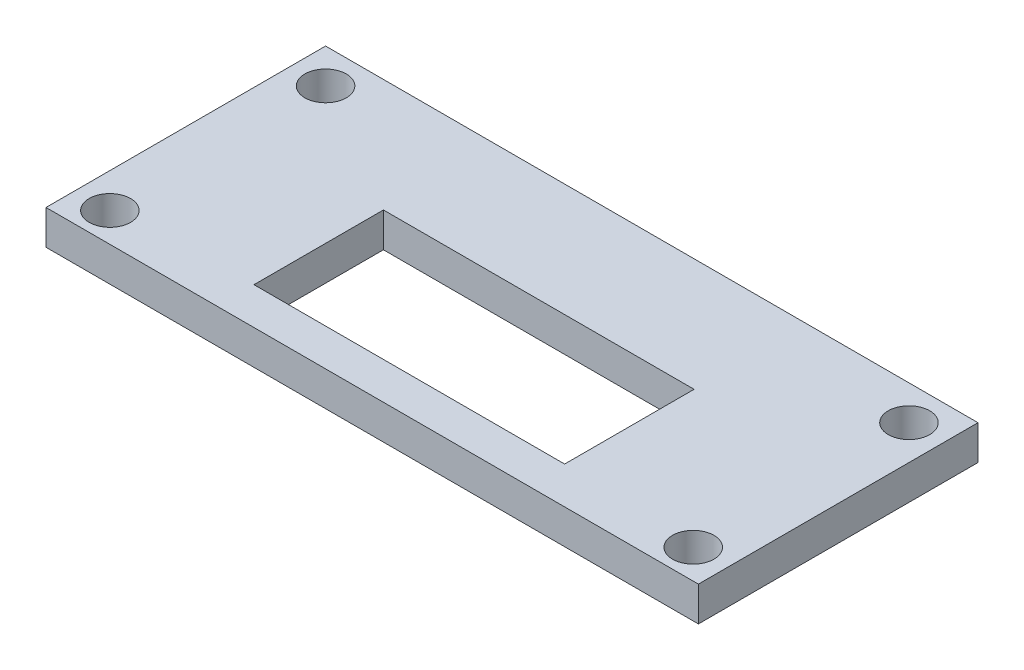
ISO-10303-21;
HEADER;
FILE_DESCRIPTION(('STEP AP214'),'2;1');
FILE_NAME('part.step','',(''),(''),'','','');
FILE_SCHEMA(('AUTOMOTIVE_DESIGN { 1 0 10303 214 1 1 1 1 }'));
ENDSEC;
DATA;
#1=APPLICATION_CONTEXT('core data for automotive mechanical design processes');
#2=APPLICATION_PROTOCOL_DEFINITION('international standard','automotive_design',2000,#1);
#3=PRODUCT_CONTEXT('',#1,'mechanical');
#4=PRODUCT('Part','Part','',(#3));
#5=PRODUCT_RELATED_PRODUCT_CATEGORY('part','',(#4));
#6=PRODUCT_DEFINITION_FORMATION('','',#4);
#7=PRODUCT_DEFINITION_CONTEXT('part definition',#1,'design');
#8=PRODUCT_DEFINITION('design','',#6,#7);
#9=PRODUCT_DEFINITION_SHAPE('','',#8);
#10=(LENGTH_UNIT() NAMED_UNIT(*) SI_UNIT(.MILLI.,.METRE.));
#11=(NAMED_UNIT(*) PLANE_ANGLE_UNIT() SI_UNIT($,.RADIAN.));
#12=(NAMED_UNIT(*) SI_UNIT($,.STERADIAN.) SOLID_ANGLE_UNIT());
#13=UNCERTAINTY_MEASURE_WITH_UNIT(LENGTH_MEASURE(1.E-05),#10,'distance_accuracy_value','');
#14=(GEOMETRIC_REPRESENTATION_CONTEXT(3) GLOBAL_UNCERTAINTY_ASSIGNED_CONTEXT((#13)) GLOBAL_UNIT_ASSIGNED_CONTEXT((#10,
#11,#12)) REPRESENTATION_CONTEXT('',''));
#15=CARTESIAN_POINT('',(0.,0.,0.));
#16=DIRECTION('',(0.,0.,1.));
#17=DIRECTION('',(1.,0.,0.));
#18=AXIS2_PLACEMENT_3D('',#15,#16,#17);
#19=CARTESIAN_POINT('',(0.,17.,0.));
#20=DIRECTION('',(0.,1.,0.));
#21=DIRECTION('',(0.,0.,1.));
#22=AXIS2_PLACEMENT_3D('',#19,#20,#21);
#23=PLANE('',#22);
#24=CARTESIAN_POINT('',(-16.9,17.,-43.5));
#25=DIRECTION('',(0.,1.,0.));
#26=DIRECTION('',(0.,0.,1.));
#27=AXIS2_PLACEMENT_3D('',#24,#25,#26);
#28=CIRCLE('',#27,1.2);
#29=CARTESIAN_POINT('',(-16.9,17.,-42.3));
#30=VERTEX_POINT('',#29);
#31=EDGE_CURVE('E117',#30,#30,#28,.F.);
#32=ORIENTED_EDGE('',*,*,#31,.T.);
#33=EDGE_LOOP('',(#32));
#34=FACE_BOUND('',#33,.T.);
#35=CARTESIAN_POINT('',(16.9,17.,-31.));
#36=DIRECTION('',(0.,1.,0.));
#37=DIRECTION('',(0.,0.,1.));
#38=AXIS2_PLACEMENT_3D('',#35,#36,#37);
#39=CIRCLE('',#38,1.2);
#40=CARTESIAN_POINT('',(16.9,17.,-29.8));
#41=VERTEX_POINT('',#40);
#42=EDGE_CURVE('E169',#41,#41,#39,.F.);
#43=ORIENTED_EDGE('',*,*,#42,.T.);
#44=EDGE_LOOP('',(#43));
#45=FACE_BOUND('',#44,.T.);
#46=CARTESIAN_POINT('',(16.9,17.,-43.5));
#47=DIRECTION('',(0.,1.,0.));
#48=DIRECTION('',(0.,0.,1.));
#49=AXIS2_PLACEMENT_3D('',#46,#47,#48);
#50=CIRCLE('',#49,1.2);
#51=CARTESIAN_POINT('',(16.9,17.,-42.3));
#52=VERTEX_POINT('',#51);
#53=EDGE_CURVE('E166',#52,#52,#50,.F.);
#54=ORIENTED_EDGE('',*,*,#53,.T.);
#55=EDGE_LOOP('',(#54));
#56=FACE_BOUND('',#55,.T.);
#57=CARTESIAN_POINT('',(-16.9,17.,-31.));
#58=DIRECTION('',(0.,1.,0.));
#59=DIRECTION('',(0.,0.,1.));
#60=AXIS2_PLACEMENT_3D('',#57,#58,#59);
#61=CIRCLE('',#60,1.2);
#62=CARTESIAN_POINT('',(-16.9,17.,-29.8));
#63=VERTEX_POINT('',#62);
#64=EDGE_CURVE('E163',#63,#63,#61,.F.);
#65=ORIENTED_EDGE('',*,*,#64,.T.);
#66=EDGE_LOOP('',(#65));
#67=FACE_BOUND('',#66,.T.);
#68=DIRECTION('',(0.,0.,1.));
#69=VECTOR('',#68,1.);
#70=CARTESIAN_POINT('',(-18.9,17.,-45.5));
#71=LINE('',#70,#69);
#72=CARTESIAN_POINT('',(-18.9,17.,-45.5));
#73=VERTEX_POINT('',#72);
#74=CARTESIAN_POINT('',(-18.9,17.,-29.3));
#75=VERTEX_POINT('',#74);
#76=EDGE_CURVE('E129',#73,#75,#71,.T.);
#77=ORIENTED_EDGE('',*,*,#76,.T.);
#78=DIRECTION('',(1.,0.,0.));
#79=VECTOR('',#78,1.);
#80=CARTESIAN_POINT('',(-18.9,17.,-29.3));
#81=LINE('',#80,#79);
#82=CARTESIAN_POINT('',(18.9,17.,-29.3));
#83=VERTEX_POINT('',#82);
#84=EDGE_CURVE('E132',#75,#83,#81,.T.);
#85=ORIENTED_EDGE('',*,*,#84,.T.);
#86=DIRECTION('',(0.,0.,-1.));
#87=VECTOR('',#86,1.);
#88=CARTESIAN_POINT('',(18.9,17.,-29.3));
#89=LINE('',#88,#87);
#90=CARTESIAN_POINT('',(18.9,17.,-45.5));
#91=VERTEX_POINT('',#90);
#92=EDGE_CURVE('E135',#83,#91,#89,.T.);
#93=ORIENTED_EDGE('',*,*,#92,.T.);
#94=DIRECTION('',(-1.,0.,0.));
#95=VECTOR('',#94,1.);
#96=CARTESIAN_POINT('',(18.9,17.,-45.5));
#97=LINE('',#96,#95);
#98=EDGE_CURVE('E137',#91,#73,#97,.T.);
#99=ORIENTED_EDGE('',*,*,#98,.T.);
#100=EDGE_LOOP('',(#77,#85,#93,#99));
#101=FACE_BOUND('',#100,.T.);
#102=DIRECTION('',(-1.,0.,0.));
#103=VECTOR('',#102,1.);
#104=CARTESIAN_POINT('',(0.,17.,-31.45));
#105=LINE('',#104,#103);
#106=CARTESIAN_POINT('',(9.,17.,-31.45));
#107=VERTEX_POINT('',#106);
#108=CARTESIAN_POINT('',(-9.,17.,-31.45));
#109=VERTEX_POINT('',#108);
#110=EDGE_CURVE('E120',#107,#109,#105,.T.);
#111=ORIENTED_EDGE('',*,*,#110,.T.);
#112=DIRECTION('',(0.,0.,-1.));
#113=VECTOR('',#112,1.);
#114=CARTESIAN_POINT('',(-9.,17.,0.));
#115=LINE('',#114,#113);
#116=CARTESIAN_POINT('',(-9.,17.,-38.95));
#117=VERTEX_POINT('',#116);
#118=EDGE_CURVE('E113',#109,#117,#115,.T.);
#119=ORIENTED_EDGE('',*,*,#118,.T.);
#120=DIRECTION('',(1.,0.,0.));
#121=VECTOR('',#120,1.);
#122=CARTESIAN_POINT('',(0.,17.,-38.95));
#123=LINE('',#122,#121);
#124=CARTESIAN_POINT('',(9.,17.,-38.95));
#125=VERTEX_POINT('',#124);
#126=EDGE_CURVE('E102',#117,#125,#123,.T.);
#127=ORIENTED_EDGE('',*,*,#126,.T.);
#128=DIRECTION('',(0.,0.,1.));
#129=VECTOR('',#128,1.);
#130=CARTESIAN_POINT('',(9.,17.,0.));
#131=LINE('',#130,#129);
#132=EDGE_CURVE('E107',#125,#107,#131,.T.);
#133=ORIENTED_EDGE('',*,*,#132,.T.);
#134=EDGE_LOOP('',(#111,#119,#127,#133));
#135=FACE_BOUND('',#134,.T.);
#136=ADVANCED_FACE('F39',(#34,#45,#56,#67,#101,#135),#23,.T.);
#137=CARTESIAN_POINT('',(0.,15.,0.));
#138=DIRECTION('',(0.,1.,0.));
#139=DIRECTION('',(0.,0.,1.));
#140=AXIS2_PLACEMENT_3D('',#137,#138,#139);
#141=PLANE('',#140);
#142=CARTESIAN_POINT('',(-16.9,15.,-43.5));
#143=DIRECTION('',(0.,1.,0.));
#144=DIRECTION('',(0.,0.,1.));
#145=AXIS2_PLACEMENT_3D('',#142,#143,#144);
#146=CIRCLE('',#145,1.2);
#147=CARTESIAN_POINT('',(-16.9,15.,-42.3));
#148=VERTEX_POINT('',#147);
#149=EDGE_CURVE('E43',#148,#148,#146,.F.);
#150=ORIENTED_EDGE('',*,*,#149,.F.);
#151=EDGE_LOOP('',(#150));
#152=FACE_BOUND('',#151,.T.);
#153=CARTESIAN_POINT('',(16.9,15.,-31.));
#154=DIRECTION('',(0.,1.,0.));
#155=DIRECTION('',(0.,0.,1.));
#156=AXIS2_PLACEMENT_3D('',#153,#154,#155);
#157=CIRCLE('',#156,1.2);
#158=CARTESIAN_POINT('',(16.9,15.,-29.8));
#159=VERTEX_POINT('',#158);
#160=EDGE_CURVE('E167',#159,#159,#157,.F.);
#161=ORIENTED_EDGE('',*,*,#160,.F.);
#162=EDGE_LOOP('',(#161));
#163=FACE_BOUND('',#162,.T.);
#164=CARTESIAN_POINT('',(16.9,15.,-43.5));
#165=DIRECTION('',(0.,1.,0.));
#166=DIRECTION('',(0.,0.,1.));
#167=AXIS2_PLACEMENT_3D('',#164,#165,#166);
#168=CIRCLE('',#167,1.2);
#169=CARTESIAN_POINT('',(16.9,15.,-42.3));
#170=VERTEX_POINT('',#169);
#171=EDGE_CURVE('E164',#170,#170,#168,.F.);
#172=ORIENTED_EDGE('',*,*,#171,.F.);
#173=EDGE_LOOP('',(#172));
#174=FACE_BOUND('',#173,.T.);
#175=CARTESIAN_POINT('',(-16.9,15.,-31.));
#176=DIRECTION('',(0.,1.,0.));
#177=DIRECTION('',(0.,0.,1.));
#178=AXIS2_PLACEMENT_3D('',#175,#176,#177);
#179=CIRCLE('',#178,1.2);
#180=CARTESIAN_POINT('',(-16.9,15.,-29.8));
#181=VERTEX_POINT('',#180);
#182=EDGE_CURVE('E160',#181,#181,#179,.F.);
#183=ORIENTED_EDGE('',*,*,#182,.F.);
#184=EDGE_LOOP('',(#183));
#185=FACE_BOUND('',#184,.T.);
#186=DIRECTION('',(0.,0.,1.));
#187=VECTOR('',#186,1.);
#188=CARTESIAN_POINT('',(-18.9,15.,-45.5));
#189=LINE('',#188,#187);
#190=CARTESIAN_POINT('',(-18.9,15.,-45.5));
#191=VERTEX_POINT('',#190);
#192=CARTESIAN_POINT('',(-18.9,15.,-29.3));
#193=VERTEX_POINT('',#192);
#194=EDGE_CURVE('E121',#191,#193,#189,.T.);
#195=ORIENTED_EDGE('',*,*,#194,.F.);
#196=DIRECTION('',(-1.,0.,0.));
#197=VECTOR('',#196,1.);
#198=CARTESIAN_POINT('',(18.9,15.,-45.5));
#199=LINE('',#198,#197);
#200=CARTESIAN_POINT('',(18.9,15.,-45.5));
#201=VERTEX_POINT('',#200);
#202=EDGE_CURVE('E133',#201,#191,#199,.T.);
#203=ORIENTED_EDGE('',*,*,#202,.F.);
#204=DIRECTION('',(0.,0.,-1.));
#205=VECTOR('',#204,1.);
#206=CARTESIAN_POINT('',(18.9,15.,-29.3));
#207=LINE('',#206,#205);
#208=CARTESIAN_POINT('',(18.9,15.,-29.3));
#209=VERTEX_POINT('',#208);
#210=EDGE_CURVE('E141',#209,#201,#207,.T.);
#211=ORIENTED_EDGE('',*,*,#210,.F.);
#212=DIRECTION('',(1.,0.,0.));
#213=VECTOR('',#212,1.);
#214=CARTESIAN_POINT('',(-18.9,15.,-29.3));
#215=LINE('',#214,#213);
#216=EDGE_CURVE('E124',#193,#209,#215,.T.);
#217=ORIENTED_EDGE('',*,*,#216,.F.);
#218=EDGE_LOOP('',(#195,#203,#211,#217));
#219=FACE_BOUND('',#218,.T.);
#220=DIRECTION('',(0.,0.,-1.));
#221=VECTOR('',#220,1.);
#222=CARTESIAN_POINT('',(-9.,15.,0.));
#223=LINE('',#222,#221);
#224=CARTESIAN_POINT('',(-9.,15.,-31.45));
#225=VERTEX_POINT('',#224);
#226=CARTESIAN_POINT('',(-9.,15.,-38.95));
#227=VERTEX_POINT('',#226);
#228=EDGE_CURVE('E11',#225,#227,#223,.T.);
#229=ORIENTED_EDGE('',*,*,#228,.F.);
#230=DIRECTION('',(-1.,0.,0.));
#231=VECTOR('',#230,1.);
#232=CARTESIAN_POINT('',(0.,15.,-31.45));
#233=LINE('',#232,#231);
#234=CARTESIAN_POINT('',(9.,15.,-31.45));
#235=VERTEX_POINT('',#234);
#236=EDGE_CURVE('E48',#235,#225,#233,.T.);
#237=ORIENTED_EDGE('',*,*,#236,.F.);
#238=DIRECTION('',(0.,0.,1.));
#239=VECTOR('',#238,1.);
#240=CARTESIAN_POINT('',(9.,15.,0.));
#241=LINE('',#240,#239);
#242=CARTESIAN_POINT('',(9.,15.,-38.95));
#243=VERTEX_POINT('',#242);
#244=EDGE_CURVE('E157',#243,#235,#241,.T.);
#245=ORIENTED_EDGE('',*,*,#244,.F.);
#246=DIRECTION('',(1.,0.,0.));
#247=VECTOR('',#246,1.);
#248=CARTESIAN_POINT('',(0.,15.,-38.95));
#249=LINE('',#248,#247);
#250=EDGE_CURVE('E155',#227,#243,#249,.T.);
#251=ORIENTED_EDGE('',*,*,#250,.F.);
#252=EDGE_LOOP('',(#229,#237,#245,#251));
#253=FACE_BOUND('',#252,.T.);
#254=ADVANCED_FACE('F194',(#152,#163,#174,#185,#219,#253),#141,.F.);
#255=CARTESIAN_POINT('',(-18.9,17.,-45.5));
#256=DIRECTION('',(1.,0.,0.));
#257=DIRECTION('',(0.,0.,-1.));
#258=AXIS2_PLACEMENT_3D('',#255,#256,#257);
#259=PLANE('',#258);
#260=ORIENTED_EDGE('',*,*,#194,.T.);
#261=DIRECTION('',(0.,-1.,0.));
#262=VECTOR('',#261,1.);
#263=CARTESIAN_POINT('',(-18.9,17.,-29.3));
#264=LINE('',#263,#262);
#265=EDGE_CURVE('E152',#75,#193,#264,.T.);
#266=ORIENTED_EDGE('',*,*,#265,.F.);
#267=ORIENTED_EDGE('',*,*,#76,.F.);
#268=DIRECTION('',(0.,-1.,0.));
#269=VECTOR('',#268,1.);
#270=CARTESIAN_POINT('',(-18.9,17.,-45.5));
#271=LINE('',#270,#269);
#272=EDGE_CURVE('E138',#73,#191,#271,.T.);
#273=ORIENTED_EDGE('',*,*,#272,.T.);
#274=EDGE_LOOP('',(#260,#266,#267,#273));
#275=FACE_BOUND('',#274,.T.);
#276=ADVANCED_FACE('F41',(#275),#259,.F.);
#277=CARTESIAN_POINT('',(-18.9,17.,-29.3));
#278=DIRECTION('',(0.,0.,-1.));
#279=DIRECTION('',(-1.,0.,0.));
#280=AXIS2_PLACEMENT_3D('',#277,#278,#279);
#281=PLANE('',#280);
#282=ORIENTED_EDGE('',*,*,#216,.T.);
#283=DIRECTION('',(0.,-1.,0.));
#284=VECTOR('',#283,1.);
#285=CARTESIAN_POINT('',(18.9,17.,-29.3));
#286=LINE('',#285,#284);
#287=EDGE_CURVE('E149',#83,#209,#286,.T.);
#288=ORIENTED_EDGE('',*,*,#287,.F.);
#289=ORIENTED_EDGE('',*,*,#84,.F.);
#290=ORIENTED_EDGE('',*,*,#265,.T.);
#291=EDGE_LOOP('',(#282,#288,#289,#290));
#292=FACE_BOUND('',#291,.T.);
#293=ADVANCED_FACE('F203',(#292),#281,.F.);
#294=CARTESIAN_POINT('',(18.9,17.,-29.3));
#295=DIRECTION('',(-1.,0.,0.));
#296=DIRECTION('',(0.,0.,1.));
#297=AXIS2_PLACEMENT_3D('',#294,#295,#296);
#298=PLANE('',#297);
#299=ORIENTED_EDGE('',*,*,#210,.T.);
#300=DIRECTION('',(0.,-1.,0.));
#301=VECTOR('',#300,1.);
#302=CARTESIAN_POINT('',(18.9,17.,-45.5));
#303=LINE('',#302,#301);
#304=EDGE_CURVE('E146',#91,#201,#303,.T.);
#305=ORIENTED_EDGE('',*,*,#304,.F.);
#306=ORIENTED_EDGE('',*,*,#92,.F.);
#307=ORIENTED_EDGE('',*,*,#287,.T.);
#308=EDGE_LOOP('',(#299,#305,#306,#307));
#309=FACE_BOUND('',#308,.T.);
#310=ADVANCED_FACE('F214',(#309),#298,.F.);
#311=CARTESIAN_POINT('',(18.9,17.,-45.5));
#312=DIRECTION('',(0.,0.,1.));
#313=DIRECTION('',(1.,0.,0.));
#314=AXIS2_PLACEMENT_3D('',#311,#312,#313);
#315=PLANE('',#314);
#316=ORIENTED_EDGE('',*,*,#202,.T.);
#317=ORIENTED_EDGE('',*,*,#272,.F.);
#318=ORIENTED_EDGE('',*,*,#98,.F.);
#319=ORIENTED_EDGE('',*,*,#304,.T.);
#320=EDGE_LOOP('',(#316,#317,#318,#319));
#321=FACE_BOUND('',#320,.T.);
#322=ADVANCED_FACE('F211',(#321),#315,.F.);
#323=CARTESIAN_POINT('',(-9.,18.,-38.95));
#324=DIRECTION('',(1.,0.,0.));
#325=DIRECTION('',(0.,0.,-1.));
#326=AXIS2_PLACEMENT_3D('',#323,#324,#325);
#327=PLANE('',#326);
#328=DIRECTION('',(0.,-1.,0.));
#329=VECTOR('',#328,1.);
#330=CARTESIAN_POINT('',(-9.,18.,-31.45));
#331=LINE('',#330,#329);
#332=EDGE_CURVE('E108',#109,#225,#331,.T.);
#333=ORIENTED_EDGE('',*,*,#332,.T.);
#334=ORIENTED_EDGE('',*,*,#228,.T.);
#335=DIRECTION('',(0.,-1.,0.));
#336=VECTOR('',#335,1.);
#337=CARTESIAN_POINT('',(-9.,18.,-38.95));
#338=LINE('',#337,#336);
#339=EDGE_CURVE('E61',#117,#227,#338,.T.);
#340=ORIENTED_EDGE('',*,*,#339,.F.);
#341=ORIENTED_EDGE('',*,*,#118,.F.);
#342=EDGE_LOOP('',(#333,#334,#340,#341));
#343=FACE_BOUND('',#342,.T.);
#344=ADVANCED_FACE('F112',(#343),#327,.T.);
#345=CARTESIAN_POINT('',(-9.,18.,-31.45));
#346=DIRECTION('',(0.,0.,-1.));
#347=DIRECTION('',(-1.,0.,0.));
#348=AXIS2_PLACEMENT_3D('',#345,#346,#347);
#349=PLANE('',#348);
#350=DIRECTION('',(0.,-1.,0.));
#351=VECTOR('',#350,1.);
#352=CARTESIAN_POINT('',(9.,18.,-31.45));
#353=LINE('',#352,#351);
#354=EDGE_CURVE('E183',#107,#235,#353,.T.);
#355=ORIENTED_EDGE('',*,*,#354,.T.);
#356=ORIENTED_EDGE('',*,*,#236,.T.);
#357=ORIENTED_EDGE('',*,*,#332,.F.);
#358=ORIENTED_EDGE('',*,*,#110,.F.);
#359=EDGE_LOOP('',(#355,#356,#357,#358));
#360=FACE_BOUND('',#359,.T.);
#361=ADVANCED_FACE('F192',(#360),#349,.T.);
#362=CARTESIAN_POINT('',(9.,18.,-31.45));
#363=DIRECTION('',(-1.,0.,0.));
#364=DIRECTION('',(0.,0.,1.));
#365=AXIS2_PLACEMENT_3D('',#362,#363,#364);
#366=PLANE('',#365);
#367=DIRECTION('',(0.,-1.,0.));
#368=VECTOR('',#367,1.);
#369=CARTESIAN_POINT('',(9.,18.,-38.95));
#370=LINE('',#369,#368);
#371=EDGE_CURVE('E56',#125,#243,#370,.T.);
#372=ORIENTED_EDGE('',*,*,#371,.T.);
#373=ORIENTED_EDGE('',*,*,#244,.T.);
#374=ORIENTED_EDGE('',*,*,#354,.F.);
#375=ORIENTED_EDGE('',*,*,#132,.F.);
#376=EDGE_LOOP('',(#372,#373,#374,#375));
#377=FACE_BOUND('',#376,.T.);
#378=ADVANCED_FACE('F188',(#377),#366,.T.);
#379=CARTESIAN_POINT('',(9.,18.,-38.95));
#380=DIRECTION('',(0.,0.,1.));
#381=DIRECTION('',(1.,0.,0.));
#382=AXIS2_PLACEMENT_3D('',#379,#380,#381);
#383=PLANE('',#382);
#384=ORIENTED_EDGE('',*,*,#339,.T.);
#385=ORIENTED_EDGE('',*,*,#250,.T.);
#386=ORIENTED_EDGE('',*,*,#371,.F.);
#387=ORIENTED_EDGE('',*,*,#126,.F.);
#388=EDGE_LOOP('',(#384,#385,#386,#387));
#389=FACE_BOUND('',#388,.T.);
#390=ADVANCED_FACE('F103',(#389),#383,.T.);
#391=CARTESIAN_POINT('',(-16.9,18.,-31.));
#392=DIRECTION('',(0.,-1.,0.));
#393=DIRECTION('',(0.,0.,-1.));
#394=AXIS2_PLACEMENT_3D('',#391,#392,#393);
#395=CYLINDRICAL_SURFACE('',#394,1.2);
#396=ORIENTED_EDGE('',*,*,#64,.F.);
#397=EDGE_LOOP('',(#396));
#398=FACE_BOUND('',#397,.T.);
#399=ORIENTED_EDGE('',*,*,#182,.T.);
#400=EDGE_LOOP('',(#399));
#401=FACE_BOUND('',#400,.T.);
#402=ADVANCED_FACE('F274',(#398,#401),#395,.F.);
#403=CARTESIAN_POINT('',(16.9,18.,-43.5));
#404=DIRECTION('',(0.,-1.,0.));
#405=DIRECTION('',(0.,0.,-1.));
#406=AXIS2_PLACEMENT_3D('',#403,#404,#405);
#407=CYLINDRICAL_SURFACE('',#406,1.2);
#408=ORIENTED_EDGE('',*,*,#53,.F.);
#409=EDGE_LOOP('',(#408));
#410=FACE_BOUND('',#409,.T.);
#411=ORIENTED_EDGE('',*,*,#171,.T.);
#412=EDGE_LOOP('',(#411));
#413=FACE_BOUND('',#412,.T.);
#414=ADVANCED_FACE('F293',(#410,#413),#407,.F.);
#415=CARTESIAN_POINT('',(16.9,18.,-31.));
#416=DIRECTION('',(0.,-1.,0.));
#417=DIRECTION('',(0.,0.,-1.));
#418=AXIS2_PLACEMENT_3D('',#415,#416,#417);
#419=CYLINDRICAL_SURFACE('',#418,1.2);
#420=ORIENTED_EDGE('',*,*,#42,.F.);
#421=EDGE_LOOP('',(#420));
#422=FACE_BOUND('',#421,.T.);
#423=ORIENTED_EDGE('',*,*,#160,.T.);
#424=EDGE_LOOP('',(#423));
#425=FACE_BOUND('',#424,.T.);
#426=ADVANCED_FACE('F302',(#422,#425),#419,.F.);
#427=CARTESIAN_POINT('',(-16.9,18.,-43.5));
#428=DIRECTION('',(0.,-1.,0.));
#429=DIRECTION('',(0.,0.,-1.));
#430=AXIS2_PLACEMENT_3D('',#427,#428,#429);
#431=CYLINDRICAL_SURFACE('',#430,1.2);
#432=ORIENTED_EDGE('',*,*,#31,.F.);
#433=EDGE_LOOP('',(#432));
#434=FACE_BOUND('',#433,.T.);
#435=ORIENTED_EDGE('',*,*,#149,.T.);
#436=EDGE_LOOP('',(#435));
#437=FACE_BOUND('',#436,.T.);
#438=ADVANCED_FACE('F311',(#434,#437),#431,.F.);
#439=CLOSED_SHELL('',(#136,#254,#276,#293,#310,#322,#344,#361,#378,#390,#402,#414,#426,#438));
#440=MANIFOLD_SOLID_BREP('B2',#439);
#441=ADVANCED_BREP_SHAPE_REPRESENTATION('',(#18,#440),#14);
#442=SHAPE_DEFINITION_REPRESENTATION(#9,#441);
ENDSEC;
END-ISO-10303-21;
